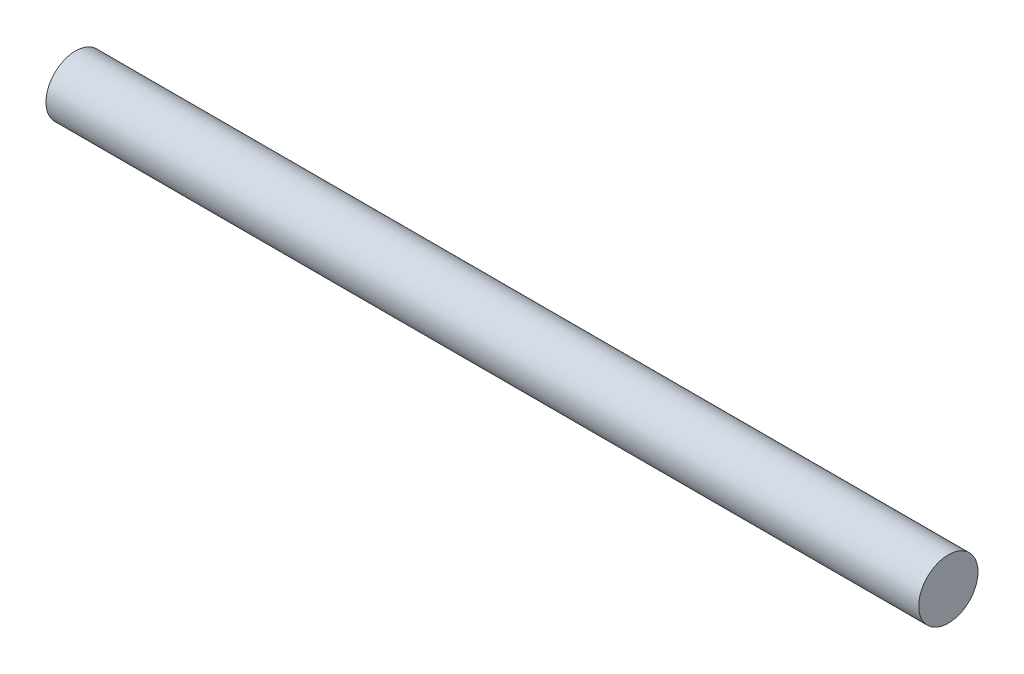
ISO-10303-21;
HEADER;
FILE_DESCRIPTION(('STEP AP214'),'2;1');
FILE_NAME('part.step','',(''),(''),'','','');
FILE_SCHEMA(('AUTOMOTIVE_DESIGN { 1 0 10303 214 1 1 1 1 }'));
ENDSEC;
DATA;
#1=APPLICATION_CONTEXT('core data for automotive mechanical design processes');
#2=APPLICATION_PROTOCOL_DEFINITION('international standard','automotive_design',2000,#1);
#3=PRODUCT_CONTEXT('',#1,'mechanical');
#4=PRODUCT('Part','Part','',(#3));
#5=PRODUCT_RELATED_PRODUCT_CATEGORY('part','',(#4));
#6=PRODUCT_DEFINITION_FORMATION('','',#4);
#7=PRODUCT_DEFINITION_CONTEXT('part definition',#1,'design');
#8=PRODUCT_DEFINITION('design','',#6,#7);
#9=PRODUCT_DEFINITION_SHAPE('','',#8);
#10=(LENGTH_UNIT() NAMED_UNIT(*) SI_UNIT(.MILLI.,.METRE.));
#11=(NAMED_UNIT(*) PLANE_ANGLE_UNIT() SI_UNIT($,.RADIAN.));
#12=(NAMED_UNIT(*) SI_UNIT($,.STERADIAN.) SOLID_ANGLE_UNIT());
#13=UNCERTAINTY_MEASURE_WITH_UNIT(LENGTH_MEASURE(1.E-05),#10,'distance_accuracy_value','');
#14=(GEOMETRIC_REPRESENTATION_CONTEXT(3) GLOBAL_UNCERTAINTY_ASSIGNED_CONTEXT((#13)) GLOBAL_UNIT_ASSIGNED_CONTEXT((#10,
#11,#12)) REPRESENTATION_CONTEXT('',''));
#15=CARTESIAN_POINT('',(0.,0.,0.));
#16=DIRECTION('',(0.,0.,1.));
#17=DIRECTION('',(1.,0.,0.));
#18=AXIS2_PLACEMENT_3D('',#15,#16,#17);
#19=CARTESIAN_POINT('',(36.8,0.,0.));
#20=DIRECTION('',(-1.,0.,0.));
#21=DIRECTION('',(0.,0.,1.));
#22=AXIS2_PLACEMENT_3D('',#19,#20,#21);
#23=CYLINDRICAL_SURFACE('',#22,1.25);
#24=CARTESIAN_POINT('',(36.8,0.,0.));
#25=DIRECTION('',(1.,0.,0.));
#26=DIRECTION('',(0.,0.,-1.));
#27=AXIS2_PLACEMENT_3D('',#24,#25,#26);
#28=CIRCLE('',#27,1.25);
#29=CARTESIAN_POINT('',(36.8,0.,-1.25));
#30=VERTEX_POINT('',#29);
#31=EDGE_CURVE('E10',#30,#30,#28,.T.);
#32=ORIENTED_EDGE('',*,*,#31,.F.);
#33=EDGE_LOOP('',(#32));
#34=FACE_BOUND('',#33,.T.);
#35=CARTESIAN_POINT('',(0.,0.,0.));
#36=DIRECTION('',(1.,0.,0.));
#37=DIRECTION('',(0.,0.,-1.));
#38=AXIS2_PLACEMENT_3D('',#35,#36,#37);
#39=CIRCLE('',#38,1.25);
#40=CARTESIAN_POINT('',(0.,0.,-1.25));
#41=VERTEX_POINT('',#40);
#42=EDGE_CURVE('E46',#41,#41,#39,.T.);
#43=ORIENTED_EDGE('',*,*,#42,.T.);
#44=EDGE_LOOP('',(#43));
#45=FACE_BOUND('',#44,.T.);
#46=ADVANCED_FACE('F43',(#34,#45),#23,.T.);
#47=CARTESIAN_POINT('',(36.8,0.,0.));
#48=DIRECTION('',(1.,0.,0.));
#49=DIRECTION('',(0.,0.,-1.));
#50=AXIS2_PLACEMENT_3D('',#47,#48,#49);
#51=PLANE('',#50);
#52=ORIENTED_EDGE('',*,*,#31,.T.);
#53=EDGE_LOOP('',(#52));
#54=FACE_BOUND('',#53,.T.);
#55=ADVANCED_FACE('F60',(#54),#51,.T.);
#56=CARTESIAN_POINT('',(0.,0.,0.));
#57=DIRECTION('',(1.,0.,0.));
#58=DIRECTION('',(0.,0.,-1.));
#59=AXIS2_PLACEMENT_3D('',#56,#57,#58);
#60=PLANE('',#59);
#61=ORIENTED_EDGE('',*,*,#42,.F.);
#62=EDGE_LOOP('',(#61));
#63=FACE_BOUND('',#62,.T.);
#64=ADVANCED_FACE('F58',(#63),#60,.F.);
#65=CLOSED_SHELL('',(#46,#55,#64));
#66=MANIFOLD_SOLID_BREP('B2',#65);
#67=ADVANCED_BREP_SHAPE_REPRESENTATION('',(#18,#66),#14);
#68=SHAPE_DEFINITION_REPRESENTATION(#9,#67);
ENDSEC;
END-ISO-10303-21;
